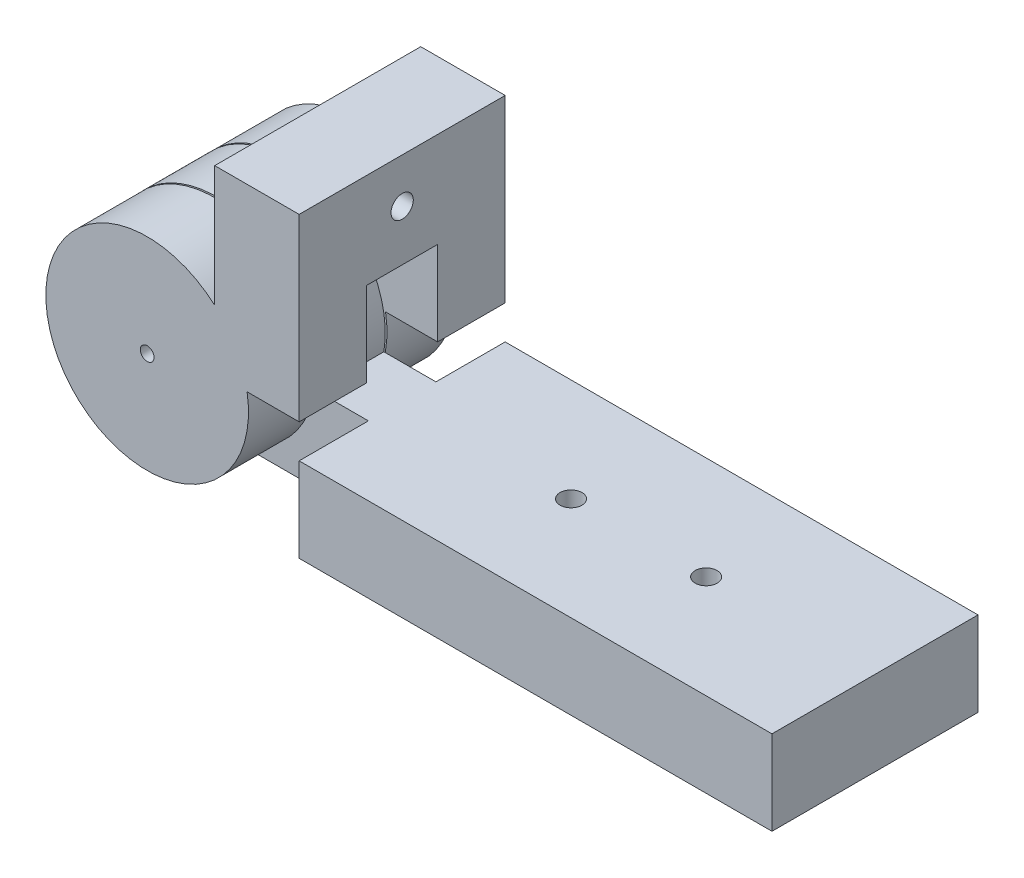
ISO-10303-21;
HEADER;
FILE_DESCRIPTION(('STEP AP214'),'2;1');
FILE_NAME('part.step','',(''),(''),'','','');
FILE_SCHEMA(('AUTOMOTIVE_DESIGN { 1 0 10303 214 1 1 1 1 }'));
ENDSEC;
DATA;
#1=APPLICATION_CONTEXT('core data for automotive mechanical design processes');
#2=APPLICATION_PROTOCOL_DEFINITION('international standard','automotive_design',2000,#1);
#3=PRODUCT_CONTEXT('',#1,'mechanical');
#4=PRODUCT('Part','Part','',(#3));
#5=PRODUCT_RELATED_PRODUCT_CATEGORY('part','',(#4));
#6=PRODUCT_DEFINITION_FORMATION('','',#4);
#7=PRODUCT_DEFINITION_CONTEXT('part definition',#1,'design');
#8=PRODUCT_DEFINITION('design','',#6,#7);
#9=PRODUCT_DEFINITION_SHAPE('','',#8);
#10=(LENGTH_UNIT() NAMED_UNIT(*) SI_UNIT(.MILLI.,.METRE.));
#11=(NAMED_UNIT(*) PLANE_ANGLE_UNIT() SI_UNIT($,.RADIAN.));
#12=(NAMED_UNIT(*) SI_UNIT($,.STERADIAN.) SOLID_ANGLE_UNIT());
#13=UNCERTAINTY_MEASURE_WITH_UNIT(LENGTH_MEASURE(1.E-05),#10,'distance_accuracy_value','');
#14=(GEOMETRIC_REPRESENTATION_CONTEXT(3) GLOBAL_UNCERTAINTY_ASSIGNED_CONTEXT((#13)) GLOBAL_UNIT_ASSIGNED_CONTEXT((#10,
#11,#12)) REPRESENTATION_CONTEXT('',''));
#15=CARTESIAN_POINT('',(0.,0.,0.));
#16=DIRECTION('',(0.,0.,1.));
#17=DIRECTION('',(1.,0.,0.));
#18=AXIS2_PLACEMENT_3D('',#15,#16,#17);
#19=CARTESIAN_POINT('',(-73.025,-41.275,6.6675));
#20=DIRECTION('',(0.,0.,1.));
#21=DIRECTION('',(1.,0.,0.));
#22=AXIS2_PLACEMENT_3D('',#19,#20,#21);
#23=PLANE('',#22);
#24=CARTESIAN_POINT('',(-73.025,-41.275,6.6675));
#25=DIRECTION('',(0.,0.,1.));
#26=DIRECTION('',(1.,0.,0.));
#27=AXIS2_PLACEMENT_3D('',#24,#25,#26);
#28=CIRCLE('',#27,5.71499999999999);
#29=CARTESIAN_POINT('',(-67.31,-41.275,6.6675));
#30=VERTEX_POINT('',#29);
#31=EDGE_CURVE('E64',#30,#30,#28,.T.);
#32=ORIENTED_EDGE('',*,*,#31,.T.);
#33=EDGE_LOOP('',(#32));
#34=FACE_BOUND('',#33,.T.);
#35=DIRECTION('',(-1.,0.,0.));
#36=VECTOR('',#35,1.);
#37=CARTESIAN_POINT('',(-44.45,-22.2250000000001,6.6675));
#38=LINE('',#37,#36);
#39=CARTESIAN_POINT('',(-44.45,-22.2250000000001,6.6675));
#40=VERTEX_POINT('',#39);
#41=CARTESIAN_POINT('',(-60.325,-22.2250000000001,6.66750000000001));
#42=VERTEX_POINT('',#41);
#43=EDGE_CURVE('E210',#40,#42,#38,.T.);
#44=ORIENTED_EDGE('',*,*,#43,.F.);
#45=DIRECTION('',(0.,-1.,0.));
#46=VECTOR('',#45,1.);
#47=CARTESIAN_POINT('',(-44.45,-38.1,6.66750000000001));
#48=LINE('',#47,#46);
#49=CARTESIAN_POINT('',(-44.45,-38.1,6.66750000000001));
#50=VERTEX_POINT('',#49);
#51=EDGE_CURVE('E184',#40,#50,#48,.T.);
#52=ORIENTED_EDGE('',*,*,#51,.T.);
#53=DIRECTION('',(-1.,0.,0.));
#54=VECTOR('',#53,1.);
#55=CARTESIAN_POINT('',(-44.45,-38.1,6.66750000000001));
#56=LINE('',#55,#54);
#57=CARTESIAN_POINT('',(-54.2414466886587,-38.1,6.6675));
#58=VERTEX_POINT('',#57);
#59=EDGE_CURVE('E180',#50,#58,#56,.T.);
#60=ORIENTED_EDGE('',*,*,#59,.T.);
#61=CARTESIAN_POINT('',(-73.025,-41.275,6.6675));
#62=DIRECTION('',(0.,0.,1.));
#63=DIRECTION('',(1.,0.,0.));
#64=AXIS2_PLACEMENT_3D('',#61,#62,#63);
#65=CIRCLE('',#64,19.05);
#66=CARTESIAN_POINT('',(-60.325,-27.0759683428763,6.66750000000001));
#67=VERTEX_POINT('',#66);
#68=EDGE_CURVE('E197',#67,#58,#65,.T.);
#69=ORIENTED_EDGE('',*,*,#68,.F.);
#70=DIRECTION('',(0.,1.,0.));
#71=VECTOR('',#70,1.);
#72=CARTESIAN_POINT('',(-60.325,38.1,6.66750000000001));
#73=LINE('',#72,#71);
#74=EDGE_CURVE('E78',#67,#42,#73,.T.);
#75=ORIENTED_EDGE('',*,*,#74,.T.);
#76=EDGE_LOOP('',(#44,#52,#60,#69,#75));
#77=FACE_BOUND('',#76,.T.);
#78=ADVANCED_FACE('F56',(#34,#77),#23,.F.);
#79=CARTESIAN_POINT('',(-73.025,-41.275,-6.6675));
#80=DIRECTION('',(0.,0.,-1.));
#81=DIRECTION('',(1.,0.,0.));
#82=AXIS2_PLACEMENT_3D('',#79,#80,#81);
#83=PLANE('',#82);
#84=CARTESIAN_POINT('',(-73.025,-41.275,-6.6675));
#85=DIRECTION('',(0.,0.,-1.));
#86=DIRECTION('',(-1.,0.,0.));
#87=AXIS2_PLACEMENT_3D('',#84,#85,#86);
#88=CIRCLE('',#87,5.71499999999999);
#89=CARTESIAN_POINT('',(-78.74,-41.275,-6.6675));
#90=VERTEX_POINT('',#89);
#91=EDGE_CURVE('E171',#90,#90,#88,.F.);
#92=ORIENTED_EDGE('',*,*,#91,.F.);
#93=EDGE_LOOP('',(#92));
#94=FACE_BOUND('',#93,.T.);
#95=DIRECTION('',(-1.,0.,0.));
#96=VECTOR('',#95,1.);
#97=CARTESIAN_POINT('',(-44.45,-22.2250000000001,-6.6675));
#98=LINE('',#97,#96);
#99=CARTESIAN_POINT('',(-44.45,-22.2250000000001,-6.66750000000001));
#100=VERTEX_POINT('',#99);
#101=CARTESIAN_POINT('',(-60.325,-22.2250000000001,-6.6675));
#102=VERTEX_POINT('',#101);
#103=EDGE_CURVE('E160',#100,#102,#98,.T.);
#104=ORIENTED_EDGE('',*,*,#103,.T.);
#105=DIRECTION('',(0.,1.,0.));
#106=VECTOR('',#105,1.);
#107=CARTESIAN_POINT('',(-60.325,38.1,-6.66750000000001));
#108=LINE('',#107,#106);
#109=CARTESIAN_POINT('',(-60.325,-27.0759683428763,-6.6675));
#110=VERTEX_POINT('',#109);
#111=EDGE_CURVE('E166',#110,#102,#108,.T.);
#112=ORIENTED_EDGE('',*,*,#111,.F.);
#113=CARTESIAN_POINT('',(-73.025,-41.275,-6.6675));
#114=DIRECTION('',(0.,0.,1.));
#115=DIRECTION('',(1.,0.,0.));
#116=AXIS2_PLACEMENT_3D('',#113,#114,#115);
#117=CIRCLE('',#116,19.05);
#118=CARTESIAN_POINT('',(-54.2414466886587,-38.1,-6.66750000000001));
#119=VERTEX_POINT('',#118);
#120=EDGE_CURVE('E172',#110,#119,#117,.T.);
#121=ORIENTED_EDGE('',*,*,#120,.T.);
#122=DIRECTION('',(-1.,0.,0.));
#123=VECTOR('',#122,1.);
#124=CARTESIAN_POINT('',(-44.45,-38.1,-6.66750000000001));
#125=LINE('',#124,#123);
#126=CARTESIAN_POINT('',(-44.45,-38.1,-6.66750000000001));
#127=VERTEX_POINT('',#126);
#128=EDGE_CURVE('E175',#127,#119,#125,.T.);
#129=ORIENTED_EDGE('',*,*,#128,.F.);
#130=DIRECTION('',(0.,-1.,0.));
#131=VECTOR('',#130,1.);
#132=CARTESIAN_POINT('',(-44.45,-38.1,-6.66750000000001));
#133=LINE('',#132,#131);
#134=EDGE_CURVE('E227',#100,#127,#133,.T.);
#135=ORIENTED_EDGE('',*,*,#134,.F.);
#136=EDGE_LOOP('',(#104,#112,#121,#129,#135));
#137=FACE_BOUND('',#136,.T.);
#138=ADVANCED_FACE('F239',(#94,#137),#83,.F.);
#139=CARTESIAN_POINT('',(-73.025,-41.275,-19.3675));
#140=DIRECTION('',(0.,0.,1.));
#141=DIRECTION('',(1.,0.,0.));
#142=AXIS2_PLACEMENT_3D('',#139,#140,#141);
#143=CYLINDRICAL_SURFACE('',#142,19.05);
#144=ORIENTED_EDGE('',*,*,#120,.F.);
#145=DIRECTION('',(0.,0.,-1.));
#146=VECTOR('',#145,1.);
#147=CARTESIAN_POINT('',(-60.325,-27.0759683428763,84.5035817680336));
#148=LINE('',#147,#146);
#149=CARTESIAN_POINT('',(-60.325,-27.0759683428763,-19.3675));
#150=VERTEX_POINT('',#149);
#151=EDGE_CURVE('E167',#110,#150,#148,.T.);
#152=ORIENTED_EDGE('',*,*,#151,.T.);
#153=CARTESIAN_POINT('',(-73.025,-41.275,-19.3675));
#154=DIRECTION('',(0.,0.,1.));
#155=DIRECTION('',(1.,0.,0.));
#156=AXIS2_PLACEMENT_3D('',#153,#154,#155);
#157=CIRCLE('',#156,19.05);
#158=CARTESIAN_POINT('',(-54.2414466886587,-38.1,-19.3675));
#159=VERTEX_POINT('',#158);
#160=EDGE_CURVE('E153',#150,#159,#157,.T.);
#161=ORIENTED_EDGE('',*,*,#160,.T.);
#162=DIRECTION('',(0.,0.,-1.));
#163=VECTOR('',#162,1.);
#164=CARTESIAN_POINT('',(-54.2414466886587,-38.1,84.5035817680336));
#165=LINE('',#164,#163);
#166=EDGE_CURVE('E157',#119,#159,#165,.T.);
#167=ORIENTED_EDGE('',*,*,#166,.F.);
#168=EDGE_LOOP('',(#144,#152,#161,#167));
#169=FACE_BOUND('',#168,.T.);
#170=ADVANCED_FACE('F237',(#169),#143,.T.);
#171=CARTESIAN_POINT('',(-73.025,-41.275,-6.6675));
#172=DIRECTION('',(0.,0.,1.));
#173=DIRECTION('',(1.,0.,0.));
#174=AXIS2_PLACEMENT_3D('',#171,#172,#173);
#175=CYLINDRICAL_SURFACE('',#174,5.71499999999999);
#176=ORIENTED_EDGE('',*,*,#91,.T.);
#177=EDGE_LOOP('',(#176));
#178=FACE_BOUND('',#177,.T.);
#179=ORIENTED_EDGE('',*,*,#31,.F.);
#180=EDGE_LOOP('',(#179));
#181=FACE_BOUND('',#180,.T.);
#182=ADVANCED_FACE('F58',(#178,#181),#175,.T.);
#183=CARTESIAN_POINT('',(-73.025,-41.275,19.3675));
#184=DIRECTION('',(0.,0.,-1.));
#185=DIRECTION('',(-1.,0.,0.));
#186=AXIS2_PLACEMENT_3D('',#183,#184,#185);
#187=CYLINDRICAL_SURFACE('',#186,19.05);
#188=ORIENTED_EDGE('',*,*,#68,.T.);
#189=DIRECTION('',(0.,0.,1.));
#190=VECTOR('',#189,1.);
#191=CARTESIAN_POINT('',(-54.2414466886587,-38.1,-71.1685817680336));
#192=LINE('',#191,#190);
#193=CARTESIAN_POINT('',(-54.2414466886587,-38.1,19.3675));
#194=VERTEX_POINT('',#193);
#195=EDGE_CURVE('E181',#58,#194,#192,.T.);
#196=ORIENTED_EDGE('',*,*,#195,.T.);
#197=CARTESIAN_POINT('',(-73.025,-41.275,19.3675));
#198=DIRECTION('',(0.,0.,1.));
#199=DIRECTION('',(1.,0.,0.));
#200=AXIS2_PLACEMENT_3D('',#197,#198,#199);
#201=CIRCLE('',#200,19.05);
#202=CARTESIAN_POINT('',(-60.325,-27.0759683428763,19.3675));
#203=VERTEX_POINT('',#202);
#204=EDGE_CURVE('E198',#203,#194,#201,.T.);
#205=ORIENTED_EDGE('',*,*,#204,.F.);
#206=DIRECTION('',(0.,0.,1.));
#207=VECTOR('',#206,1.);
#208=CARTESIAN_POINT('',(-60.325,-27.0759683428763,-71.1685817680336));
#209=LINE('',#208,#207);
#210=EDGE_CURVE('E193',#67,#203,#209,.T.);
#211=ORIENTED_EDGE('',*,*,#210,.F.);
#212=EDGE_LOOP('',(#188,#196,#205,#211));
#213=FACE_BOUND('',#212,.T.);
#214=ADVANCED_FACE('F258',(#213),#187,.T.);
#215=CARTESIAN_POINT('',(-73.025,-41.275,19.3675));
#216=DIRECTION('',(0.,0.,1.));
#217=DIRECTION('',(1.,0.,0.));
#218=AXIS2_PLACEMENT_3D('',#215,#216,#217);
#219=PLANE('',#218);
#220=CARTESIAN_POINT('',(-73.025,-41.275,19.3675));
#221=DIRECTION('',(0.,0.,1.));
#222=DIRECTION('',(1.,0.,0.));
#223=AXIS2_PLACEMENT_3D('',#220,#221,#222);
#224=CIRCLE('',#223,1.288075884885);
#225=CARTESIAN_POINT('',(-71.736924115115,-41.275,19.3675));
#226=VERTEX_POINT('',#225);
#227=EDGE_CURVE('E307',#226,#226,#224,.T.);
#228=ORIENTED_EDGE('',*,*,#227,.F.);
#229=EDGE_LOOP('',(#228));
#230=FACE_BOUND('',#229,.T.);
#231=DIRECTION('',(-1.,0.,0.));
#232=VECTOR('',#231,1.);
#233=CARTESIAN_POINT('',(44.45,-4.31799999999998,19.3675));
#234=LINE('',#233,#232);
#235=CARTESIAN_POINT('',(-44.45,-4.31799999999999,19.3675));
#236=VERTEX_POINT('',#235);
#237=CARTESIAN_POINT('',(-60.325,-4.31799999999999,19.3675));
#238=VERTEX_POINT('',#237);
#239=EDGE_CURVE('E146',#236,#238,#234,.T.);
#240=ORIENTED_EDGE('',*,*,#239,.T.);
#241=DIRECTION('',(0.,-1.,0.));
#242=VECTOR('',#241,1.);
#243=CARTESIAN_POINT('',(-60.325,38.1,19.3675));
#244=LINE('',#243,#242);
#245=EDGE_CURVE('E145',#238,#203,#244,.T.);
#246=ORIENTED_EDGE('',*,*,#245,.T.);
#247=ORIENTED_EDGE('',*,*,#204,.T.);
#248=DIRECTION('',(1.,0.,0.));
#249=VECTOR('',#248,1.);
#250=CARTESIAN_POINT('',(-44.45,-38.1,19.3675));
#251=LINE('',#250,#249);
#252=CARTESIAN_POINT('',(-44.45,-38.1,19.3675));
#253=VERTEX_POINT('',#252);
#254=EDGE_CURVE('E178',#194,#253,#251,.T.);
#255=ORIENTED_EDGE('',*,*,#254,.T.);
#256=DIRECTION('',(0.,1.,0.));
#257=VECTOR('',#256,1.);
#258=CARTESIAN_POINT('',(-44.45,-38.1,19.3675));
#259=LINE('',#258,#257);
#260=EDGE_CURVE('E187',#253,#236,#259,.T.);
#261=ORIENTED_EDGE('',*,*,#260,.T.);
#262=EDGE_LOOP('',(#240,#246,#247,#255,#261));
#263=FACE_BOUND('',#262,.T.);
#264=ADVANCED_FACE('F254',(#230,#263),#219,.T.);
#265=CARTESIAN_POINT('',(-44.45,-38.1,-71.1685817680336));
#266=DIRECTION('',(0.,-1.,0.));
#267=DIRECTION('',(0.,0.,-1.));
#268=AXIS2_PLACEMENT_3D('',#265,#266,#267);
#269=PLANE('',#268);
#270=ORIENTED_EDGE('',*,*,#59,.F.);
#271=DIRECTION('',(0.,0.,1.));
#272=VECTOR('',#271,1.);
#273=CARTESIAN_POINT('',(-44.45,-38.1,-71.1685817680336));
#274=LINE('',#273,#272);
#275=EDGE_CURVE('E191',#50,#253,#274,.T.);
#276=ORIENTED_EDGE('',*,*,#275,.T.);
#277=ORIENTED_EDGE('',*,*,#254,.F.);
#278=ORIENTED_EDGE('',*,*,#195,.F.);
#279=EDGE_LOOP('',(#270,#276,#277,#278));
#280=FACE_BOUND('',#279,.T.);
#281=ADVANCED_FACE('F248',(#280),#269,.T.);
#282=CARTESIAN_POINT('',(-60.325,38.1,-71.1685817680336));
#283=DIRECTION('',(-1.,0.,0.));
#284=DIRECTION('',(0.,-1.,0.));
#285=AXIS2_PLACEMENT_3D('',#282,#283,#284);
#286=PLANE('',#285);
#287=DIRECTION('',(0.,0.,1.));
#288=VECTOR('',#287,1.);
#289=CARTESIAN_POINT('',(-60.325,-4.31799999999999,-19.3675));
#290=LINE('',#289,#288);
#291=CARTESIAN_POINT('',(-60.325,-4.31799999999999,-19.3675));
#292=VERTEX_POINT('',#291);
#293=EDGE_CURVE('E132',#292,#238,#290,.T.);
#294=ORIENTED_EDGE('',*,*,#293,.F.);
#295=DIRECTION('',(0.,-1.,0.));
#296=VECTOR('',#295,1.);
#297=CARTESIAN_POINT('',(-60.325,38.1,-19.3675));
#298=LINE('',#297,#296);
#299=EDGE_CURVE('E142',#292,#150,#298,.T.);
#300=ORIENTED_EDGE('',*,*,#299,.T.);
#301=ORIENTED_EDGE('',*,*,#151,.F.);
#302=ORIENTED_EDGE('',*,*,#111,.T.);
#303=DIRECTION('',(0.,0.,1.));
#304=VECTOR('',#303,1.);
#305=CARTESIAN_POINT('',(-60.325,-22.2250000000001,-69.0463525864335));
#306=LINE('',#305,#304);
#307=EDGE_CURVE('E221',#102,#42,#306,.T.);
#308=ORIENTED_EDGE('',*,*,#307,.T.);
#309=ORIENTED_EDGE('',*,*,#74,.F.);
#310=ORIENTED_EDGE('',*,*,#210,.T.);
#311=ORIENTED_EDGE('',*,*,#245,.F.);
#312=EDGE_LOOP('',(#294,#300,#301,#302,#308,#309,#310,#311));
#313=FACE_BOUND('',#312,.T.);
#314=CARTESIAN_POINT('',(-60.325,-12.7,0.));
#315=DIRECTION('',(-1.,0.,0.));
#316=DIRECTION('',(0.,-1.,0.));
#317=AXIS2_PLACEMENT_3D('',#314,#315,#316);
#318=CIRCLE('',#317,2.0955);
#319=CARTESIAN_POINT('',(-60.325,-14.7955,0.));
#320=VERTEX_POINT('',#319);
#321=EDGE_CURVE('E206',#320,#320,#318,.T.);
#322=ORIENTED_EDGE('',*,*,#321,.F.);
#323=EDGE_LOOP('',(#322));
#324=FACE_BOUND('',#323,.T.);
#325=ADVANCED_FACE('F140',(#313,#324),#286,.T.);
#326=CARTESIAN_POINT('',(-44.45,-38.1,-71.1685817680336));
#327=DIRECTION('',(1.,0.,0.));
#328=DIRECTION('',(0.,1.,0.));
#329=AXIS2_PLACEMENT_3D('',#326,#327,#328);
#330=PLANE('',#329);
#331=DIRECTION('',(0.,0.,-1.));
#332=VECTOR('',#331,1.);
#333=CARTESIAN_POINT('',(-44.45,-4.31799999999999,-71.1685817680336));
#334=LINE('',#333,#332);
#335=CARTESIAN_POINT('',(-44.45,-4.318,-19.3675));
#336=VERTEX_POINT('',#335);
#337=EDGE_CURVE('E70',#236,#336,#334,.T.);
#338=ORIENTED_EDGE('',*,*,#337,.F.);
#339=ORIENTED_EDGE('',*,*,#260,.F.);
#340=ORIENTED_EDGE('',*,*,#275,.F.);
#341=ORIENTED_EDGE('',*,*,#51,.F.);
#342=DIRECTION('',(0.,0.,1.));
#343=VECTOR('',#342,1.);
#344=CARTESIAN_POINT('',(-44.45,-22.2250000000001,-69.0463525864335));
#345=LINE('',#344,#343);
#346=EDGE_CURVE('E205',#100,#40,#345,.T.);
#347=ORIENTED_EDGE('',*,*,#346,.F.);
#348=ORIENTED_EDGE('',*,*,#134,.T.);
#349=DIRECTION('',(0.,0.,-1.));
#350=VECTOR('',#349,1.);
#351=CARTESIAN_POINT('',(-44.45,-38.1,84.5035817680336));
#352=LINE('',#351,#350);
#353=CARTESIAN_POINT('',(-44.45,-38.1,-19.3675));
#354=VERTEX_POINT('',#353);
#355=EDGE_CURVE('E164',#127,#354,#352,.T.);
#356=ORIENTED_EDGE('',*,*,#355,.T.);
#357=DIRECTION('',(0.,1.,0.));
#358=VECTOR('',#357,1.);
#359=CARTESIAN_POINT('',(-44.45,-38.1,-19.3675));
#360=LINE('',#359,#358);
#361=EDGE_CURVE('E154',#354,#336,#360,.T.);
#362=ORIENTED_EDGE('',*,*,#361,.T.);
#363=EDGE_LOOP('',(#338,#339,#340,#341,#347,#348,#356,#362));
#364=FACE_BOUND('',#363,.T.);
#365=CARTESIAN_POINT('',(-44.45,-12.7,0.));
#366=DIRECTION('',(1.,0.,0.));
#367=DIRECTION('',(0.,1.,0.));
#368=AXIS2_PLACEMENT_3D('',#365,#366,#367);
#369=CIRCLE('',#368,2.0955);
#370=CARTESIAN_POINT('',(-44.45,-10.6045,0.));
#371=VERTEX_POINT('',#370);
#372=EDGE_CURVE('E203',#371,#371,#369,.T.);
#373=ORIENTED_EDGE('',*,*,#372,.F.);
#374=EDGE_LOOP('',(#373));
#375=FACE_BOUND('',#374,.T.);
#376=ADVANCED_FACE('F251',(#364,#375),#330,.T.);
#377=CARTESIAN_POINT('',(-73.025,-41.275,-19.3675));
#378=DIRECTION('',(0.,0.,-1.));
#379=DIRECTION('',(1.,0.,0.));
#380=AXIS2_PLACEMENT_3D('',#377,#378,#379);
#381=PLANE('',#380);
#382=CARTESIAN_POINT('',(-73.025,-41.275,-19.3675));
#383=DIRECTION('',(0.,0.,1.));
#384=DIRECTION('',(1.,0.,0.));
#385=AXIS2_PLACEMENT_3D('',#382,#383,#384);
#386=CIRCLE('',#385,1.288075884885);
#387=CARTESIAN_POINT('',(-71.736924115115,-41.275,-19.3675));
#388=VERTEX_POINT('',#387);
#389=EDGE_CURVE('E147',#388,#388,#386,.T.);
#390=ORIENTED_EDGE('',*,*,#389,.T.);
#391=EDGE_LOOP('',(#390));
#392=FACE_BOUND('',#391,.T.);
#393=DIRECTION('',(-1.,0.,0.));
#394=VECTOR('',#393,1.);
#395=CARTESIAN_POINT('',(-73.025,-4.318,-19.3675));
#396=LINE('',#395,#394);
#397=EDGE_CURVE('E14',#336,#292,#396,.T.);
#398=ORIENTED_EDGE('',*,*,#397,.F.);
#399=ORIENTED_EDGE('',*,*,#361,.F.);
#400=DIRECTION('',(1.,0.,0.));
#401=VECTOR('',#400,1.);
#402=CARTESIAN_POINT('',(-44.45,-38.1,-19.3675));
#403=LINE('',#402,#401);
#404=EDGE_CURVE('E155',#159,#354,#403,.T.);
#405=ORIENTED_EDGE('',*,*,#404,.F.);
#406=ORIENTED_EDGE('',*,*,#160,.F.);
#407=ORIENTED_EDGE('',*,*,#299,.F.);
#408=EDGE_LOOP('',(#398,#399,#405,#406,#407));
#409=FACE_BOUND('',#408,.T.);
#410=ADVANCED_FACE('F150',(#392,#409),#381,.T.);
#411=CARTESIAN_POINT('',(-44.45,-38.1,84.5035817680336));
#412=DIRECTION('',(0.,1.,0.));
#413=DIRECTION('',(0.,0.,1.));
#414=AXIS2_PLACEMENT_3D('',#411,#412,#413);
#415=PLANE('',#414);
#416=ORIENTED_EDGE('',*,*,#355,.F.);
#417=ORIENTED_EDGE('',*,*,#128,.T.);
#418=ORIENTED_EDGE('',*,*,#166,.T.);
#419=ORIENTED_EDGE('',*,*,#404,.T.);
#420=EDGE_LOOP('',(#416,#417,#418,#419));
#421=FACE_BOUND('',#420,.T.);
#422=ADVANCED_FACE('F232',(#421),#415,.F.);
#423=CARTESIAN_POINT('',(-44.45,-22.2250000000001,-69.0463525864335));
#424=DIRECTION('',(0.,1.,0.));
#425=DIRECTION('',(0.,0.,1.));
#426=AXIS2_PLACEMENT_3D('',#423,#424,#425);
#427=PLANE('',#426);
#428=ORIENTED_EDGE('',*,*,#103,.F.);
#429=ORIENTED_EDGE('',*,*,#346,.T.);
#430=ORIENTED_EDGE('',*,*,#43,.T.);
#431=ORIENTED_EDGE('',*,*,#307,.F.);
#432=EDGE_LOOP('',(#428,#429,#430,#431));
#433=FACE_BOUND('',#432,.T.);
#434=ADVANCED_FACE('F242',(#433),#427,.F.);
#435=CARTESIAN_POINT('',(44.45,-12.7,0.));
#436=DIRECTION('',(-1.,0.,0.));
#437=DIRECTION('',(0.,-1.,0.));
#438=AXIS2_PLACEMENT_3D('',#435,#436,#437);
#439=CYLINDRICAL_SURFACE('',#438,2.0955);
#440=ORIENTED_EDGE('',*,*,#372,.T.);
#441=EDGE_LOOP('',(#440));
#442=FACE_BOUND('',#441,.T.);
#443=ORIENTED_EDGE('',*,*,#321,.T.);
#444=EDGE_LOOP('',(#443));
#445=FACE_BOUND('',#444,.T.);
#446=ADVANCED_FACE('F292',(#442,#445),#439,.F.);
#447=CARTESIAN_POINT('',(44.45,-4.31799999999998,-19.3675));
#448=DIRECTION('',(0.,-1.,0.));
#449=DIRECTION('',(1.,0.,0.));
#450=AXIS2_PLACEMENT_3D('',#447,#448,#449);
#451=PLANE('',#450);
#452=ORIENTED_EDGE('',*,*,#337,.T.);
#453=ORIENTED_EDGE('',*,*,#397,.T.);
#454=ORIENTED_EDGE('',*,*,#293,.T.);
#455=ORIENTED_EDGE('',*,*,#239,.F.);
#456=EDGE_LOOP('',(#452,#453,#454,#455));
#457=FACE_BOUND('',#456,.T.);
#458=ADVANCED_FACE('F131',(#457),#451,.F.);
#459=CARTESIAN_POINT('',(-73.025,-41.275,-19.3675));
#460=DIRECTION('',(0.,0.,1.));
#461=DIRECTION('',(1.,0.,0.));
#462=AXIS2_PLACEMENT_3D('',#459,#460,#461);
#463=CYLINDRICAL_SURFACE('',#462,1.288075884885);
#464=ORIENTED_EDGE('',*,*,#389,.F.);
#465=EDGE_LOOP('',(#464));
#466=FACE_BOUND('',#465,.T.);
#467=ORIENTED_EDGE('',*,*,#227,.T.);
#468=EDGE_LOOP('',(#467));
#469=FACE_BOUND('',#468,.T.);
#470=ADVANCED_FACE('F297',(#466,#469),#463,.F.);
#471=CLOSED_SHELL('',(#78,#138,#170,#182,#214,#264,#281,#325,#376,#410,#422,#434,#446,#458,#470));
#472=MANIFOLD_SOLID_BREP('B2',#471);
#473=CARTESIAN_POINT('',(-73.025,-41.275,6.35));
#474=DIRECTION('',(0.,0.,1.));
#475=DIRECTION('',(1.,0.,0.));
#476=AXIS2_PLACEMENT_3D('',#473,#474,#475);
#477=PLANE('',#476);
#478=CARTESIAN_POINT('',(-73.025,-41.275,6.35));
#479=DIRECTION('',(0.,0.,1.));
#480=DIRECTION('',(1.,0.,0.));
#481=AXIS2_PLACEMENT_3D('',#478,#479,#480);
#482=CIRCLE('',#481,6.35);
#483=CARTESIAN_POINT('',(-66.675,-41.275,6.35));
#484=VERTEX_POINT('',#483);
#485=EDGE_CURVE('E546',#484,#484,#482,.T.);
#486=ORIENTED_EDGE('',*,*,#485,.F.);
#487=EDGE_LOOP('',(#486));
#488=FACE_BOUND('',#487,.T.);
#489=DIRECTION('',(1.,0.,0.));
#490=VECTOR('',#489,1.);
#491=CARTESIAN_POINT('',(44.45,-60.325,6.35));
#492=LINE('',#491,#490);
#493=CARTESIAN_POINT('',(-73.025,-60.3250000000001,6.35));
#494=VERTEX_POINT('',#493);
#495=CARTESIAN_POINT('',(-44.45,-60.325,6.35));
#496=VERTEX_POINT('',#495);
#497=EDGE_CURVE('E550',#494,#496,#492,.T.);
#498=ORIENTED_EDGE('',*,*,#497,.T.);
#499=DIRECTION('',(0.,1.,0.));
#500=VECTOR('',#499,1.);
#501=CARTESIAN_POINT('',(-44.45,-41.275,6.35));
#502=LINE('',#501,#500);
#503=CARTESIAN_POINT('',(-44.45,-44.45,6.35));
#504=VERTEX_POINT('',#503);
#505=EDGE_CURVE('E443',#496,#504,#502,.T.);
#506=ORIENTED_EDGE('',*,*,#505,.T.);
#507=DIRECTION('',(-1.,0.,0.));
#508=VECTOR('',#507,1.);
#509=CARTESIAN_POINT('',(-54.2414466886587,-44.45,6.35));
#510=LINE('',#509,#508);
#511=CARTESIAN_POINT('',(-54.2414466886587,-44.45,6.35));
#512=VERTEX_POINT('',#511);
#513=EDGE_CURVE('E557',#504,#512,#510,.T.);
#514=ORIENTED_EDGE('',*,*,#513,.T.);
#515=CARTESIAN_POINT('',(-73.025,-41.275,6.35));
#516=DIRECTION('',(0.,0.,1.));
#517=DIRECTION('',(1.,0.,0.));
#518=AXIS2_PLACEMENT_3D('',#515,#516,#517);
#519=CIRCLE('',#518,19.05);
#520=EDGE_CURVE('E54',#512,#494,#519,.T.);
#521=ORIENTED_EDGE('',*,*,#520,.T.);
#522=EDGE_LOOP('',(#498,#506,#514,#521));
#523=FACE_BOUND('',#522,.T.);
#524=ADVANCED_FACE('F428',(#488,#523),#477,.T.);
#525=CARTESIAN_POINT('',(-73.025,-41.275,-6.35));
#526=DIRECTION('',(0.,0.,1.));
#527=DIRECTION('',(1.,0.,0.));
#528=AXIS2_PLACEMENT_3D('',#525,#526,#527);
#529=PLANE('',#528);
#530=CARTESIAN_POINT('',(-73.025,-41.275,-6.35));
#531=DIRECTION('',(0.,0.,1.));
#532=DIRECTION('',(1.,0.,0.));
#533=AXIS2_PLACEMENT_3D('',#530,#531,#532);
#534=CIRCLE('',#533,6.35);
#535=CARTESIAN_POINT('',(-66.675,-41.275,-6.35));
#536=VERTEX_POINT('',#535);
#537=EDGE_CURVE('E547',#536,#536,#534,.T.);
#538=ORIENTED_EDGE('',*,*,#537,.T.);
#539=EDGE_LOOP('',(#538));
#540=FACE_BOUND('',#539,.T.);
#541=DIRECTION('',(0.,1.,0.));
#542=VECTOR('',#541,1.);
#543=CARTESIAN_POINT('',(-44.45,-41.275,-6.35));
#544=LINE('',#543,#542);
#545=CARTESIAN_POINT('',(-44.45,-60.325,-6.34999999999999));
#546=VERTEX_POINT('',#545);
#547=CARTESIAN_POINT('',(-44.45,-44.45,-6.34999999999999));
#548=VERTEX_POINT('',#547);
#549=EDGE_CURVE('E499',#546,#548,#544,.T.);
#550=ORIENTED_EDGE('',*,*,#549,.F.);
#551=DIRECTION('',(-1.,0.,0.));
#552=VECTOR('',#551,1.);
#553=CARTESIAN_POINT('',(44.45,-60.325,-6.34999999999999));
#554=LINE('',#553,#552);
#555=CARTESIAN_POINT('',(-73.025,-60.3250000000001,-6.35));
#556=VERTEX_POINT('',#555);
#557=EDGE_CURVE('E554',#546,#556,#554,.T.);
#558=ORIENTED_EDGE('',*,*,#557,.T.);
#559=CARTESIAN_POINT('',(-73.025,-41.275,-6.35));
#560=DIRECTION('',(0.,0.,1.));
#561=DIRECTION('',(1.,0.,0.));
#562=AXIS2_PLACEMENT_3D('',#559,#560,#561);
#563=CIRCLE('',#562,19.05);
#564=CARTESIAN_POINT('',(-54.2414466886587,-44.45,-6.34999999999999));
#565=VERTEX_POINT('',#564);
#566=EDGE_CURVE('E432',#565,#556,#563,.T.);
#567=ORIENTED_EDGE('',*,*,#566,.F.);
#568=DIRECTION('',(1.,0.,0.));
#569=VECTOR('',#568,1.);
#570=CARTESIAN_POINT('',(-54.2414466886587,-44.45,-6.34999999999999));
#571=LINE('',#570,#569);
#572=EDGE_CURVE('E451',#565,#548,#571,.T.);
#573=ORIENTED_EDGE('',*,*,#572,.T.);
#574=EDGE_LOOP('',(#550,#558,#567,#573));
#575=FACE_BOUND('',#574,.T.);
#576=ADVANCED_FACE('F595',(#540,#575),#529,.F.);
#577=CARTESIAN_POINT('',(-73.025,-41.275,6.35));
#578=DIRECTION('',(0.,0.,-1.));
#579=DIRECTION('',(-1.,0.,0.));
#580=AXIS2_PLACEMENT_3D('',#577,#578,#579);
#581=CYLINDRICAL_SURFACE('',#580,19.05);
#582=ORIENTED_EDGE('',*,*,#520,.F.);
#583=DIRECTION('',(0.,0.,1.));
#584=VECTOR('',#583,1.);
#585=CARTESIAN_POINT('',(-54.2414466886587,-44.45,-124.892782361475));
#586=LINE('',#585,#584);
#587=EDGE_CURVE('E555',#565,#512,#586,.T.);
#588=ORIENTED_EDGE('',*,*,#587,.F.);
#589=ORIENTED_EDGE('',*,*,#566,.T.);
#590=DIRECTION('',(0.,0.,1.));
#591=VECTOR('',#590,1.);
#592=CARTESIAN_POINT('',(-73.025,-60.3250000000001,-124.892782361475));
#593=LINE('',#592,#591);
#594=EDGE_CURVE('E559',#556,#494,#593,.T.);
#595=ORIENTED_EDGE('',*,*,#594,.T.);
#596=EDGE_LOOP('',(#582,#588,#589,#595));
#597=FACE_BOUND('',#596,.T.);
#598=ADVANCED_FACE('F430',(#597),#581,.T.);
#599=CARTESIAN_POINT('',(-54.2414466886587,-44.45,-124.892782361475));
#600=DIRECTION('',(0.,1.,0.));
#601=DIRECTION('',(-1.,0.,0.));
#602=AXIS2_PLACEMENT_3D('',#599,#600,#601);
#603=PLANE('',#602);
#604=CARTESIAN_POINT('',(12.7,-44.45,0.));
#605=DIRECTION('',(0.,1.,0.));
#606=DIRECTION('',(-1.,0.,0.));
#607=AXIS2_PLACEMENT_3D('',#604,#605,#606);
#608=CIRCLE('',#607,2.06375);
#609=CARTESIAN_POINT('',(10.63625,-44.45,0.));
#610=VERTEX_POINT('',#609);
#611=EDGE_CURVE('E632',#610,#610,#608,.T.);
#612=ORIENTED_EDGE('',*,*,#611,.F.);
#613=EDGE_LOOP('',(#612));
#614=FACE_BOUND('',#613,.T.);
#615=CARTESIAN_POINT('',(-12.7,-44.45,0.));
#616=DIRECTION('',(0.,1.,0.));
#617=DIRECTION('',(-1.,0.,0.));
#618=AXIS2_PLACEMENT_3D('',#615,#616,#617);
#619=CIRCLE('',#618,2.06375);
#620=CARTESIAN_POINT('',(-14.76375,-44.45,0.));
#621=VERTEX_POINT('',#620);
#622=EDGE_CURVE('E521',#621,#621,#619,.T.);
#623=ORIENTED_EDGE('',*,*,#622,.F.);
#624=EDGE_LOOP('',(#623));
#625=FACE_BOUND('',#624,.T.);
#626=DIRECTION('',(0.,0.,1.));
#627=VECTOR('',#626,1.);
#628=CARTESIAN_POINT('',(44.45,-44.45,-124.892782361475));
#629=LINE('',#628,#627);
#630=CARTESIAN_POINT('',(44.45,-44.45,-19.3675));
#631=VERTEX_POINT('',#630);
#632=CARTESIAN_POINT('',(44.45,-44.45,19.3675));
#633=VERTEX_POINT('',#632);
#634=EDGE_CURVE('E517',#631,#633,#629,.T.);
#635=ORIENTED_EDGE('',*,*,#634,.F.);
#636=DIRECTION('',(-1.,0.,0.));
#637=VECTOR('',#636,1.);
#638=CARTESIAN_POINT('',(44.45,-44.45,-19.3675));
#639=LINE('',#638,#637);
#640=CARTESIAN_POINT('',(-44.45,-44.45,-19.3675));
#641=VERTEX_POINT('',#640);
#642=EDGE_CURVE('E510',#631,#641,#639,.T.);
#643=ORIENTED_EDGE('',*,*,#642,.T.);
#644=DIRECTION('',(0.,0.,-1.));
#645=VECTOR('',#644,1.);
#646=CARTESIAN_POINT('',(-44.45,-44.45,109.673787848632));
#647=LINE('',#646,#645);
#648=EDGE_CURVE('E494',#548,#641,#647,.T.);
#649=ORIENTED_EDGE('',*,*,#648,.F.);
#650=ORIENTED_EDGE('',*,*,#572,.F.);
#651=ORIENTED_EDGE('',*,*,#587,.T.);
#652=ORIENTED_EDGE('',*,*,#513,.F.);
#653=CARTESIAN_POINT('',(-44.45,-44.45,19.3675));
#654=VERTEX_POINT('',#653);
#655=EDGE_CURVE('E502',#654,#504,#647,.T.);
#656=ORIENTED_EDGE('',*,*,#655,.F.);
#657=DIRECTION('',(-1.,0.,0.));
#658=VECTOR('',#657,1.);
#659=CARTESIAN_POINT('',(44.45,-44.45,19.3675));
#660=LINE('',#659,#658);
#661=EDGE_CURVE('E530',#633,#654,#660,.T.);
#662=ORIENTED_EDGE('',*,*,#661,.F.);
#663=EDGE_LOOP('',(#635,#643,#649,#650,#651,#652,#656,#662));
#664=FACE_BOUND('',#663,.T.);
#665=ADVANCED_FACE('F515',(#614,#625,#664),#603,.T.);
#666=CARTESIAN_POINT('',(44.45,-44.45,-124.892782361475));
#667=DIRECTION('',(1.,0.,0.));
#668=DIRECTION('',(0.,0.,-1.));
#669=AXIS2_PLACEMENT_3D('',#666,#667,#668);
#670=PLANE('',#669);
#671=DIRECTION('',(0.,0.,1.));
#672=VECTOR('',#671,1.);
#673=CARTESIAN_POINT('',(44.45,-60.325,-124.892782361475));
#674=LINE('',#673,#672);
#675=CARTESIAN_POINT('',(44.45,-60.325,-19.3675));
#676=VERTEX_POINT('',#675);
#677=CARTESIAN_POINT('',(44.45,-60.325,19.3675));
#678=VERTEX_POINT('',#677);
#679=EDGE_CURVE('E563',#676,#678,#674,.T.);
#680=ORIENTED_EDGE('',*,*,#679,.F.);
#681=DIRECTION('',(0.,1.,0.));
#682=VECTOR('',#681,1.);
#683=CARTESIAN_POINT('',(44.45,-60.325,-19.3675));
#684=LINE('',#683,#682);
#685=EDGE_CURVE('E503',#676,#631,#684,.T.);
#686=ORIENTED_EDGE('',*,*,#685,.T.);
#687=ORIENTED_EDGE('',*,*,#634,.T.);
#688=DIRECTION('',(0.,1.,0.));
#689=VECTOR('',#688,1.);
#690=CARTESIAN_POINT('',(44.45,-60.325,19.3675));
#691=LINE('',#690,#689);
#692=EDGE_CURVE('E533',#678,#633,#691,.T.);
#693=ORIENTED_EDGE('',*,*,#692,.F.);
#694=EDGE_LOOP('',(#680,#686,#687,#693));
#695=FACE_BOUND('',#694,.T.);
#696=ADVANCED_FACE('F582',(#695),#670,.T.);
#697=CARTESIAN_POINT('',(44.45,-60.325,-124.892782361475));
#698=DIRECTION('',(0.,-1.,0.));
#699=DIRECTION('',(1.,0.,0.));
#700=AXIS2_PLACEMENT_3D('',#697,#698,#699);
#701=PLANE('',#700);
#702=CARTESIAN_POINT('',(12.7,-60.3250000000001,0.));
#703=DIRECTION('',(0.,1.,0.));
#704=DIRECTION('',(-1.,0.,0.));
#705=AXIS2_PLACEMENT_3D('',#702,#703,#704);
#706=CIRCLE('',#705,2.06375);
#707=CARTESIAN_POINT('',(10.63625,-60.3250000000001,0.));
#708=VERTEX_POINT('',#707);
#709=EDGE_CURVE('E629',#708,#708,#706,.T.);
#710=ORIENTED_EDGE('',*,*,#709,.T.);
#711=EDGE_LOOP('',(#710));
#712=FACE_BOUND('',#711,.T.);
#713=CARTESIAN_POINT('',(-12.7,-60.3250000000001,0.));
#714=DIRECTION('',(0.,1.,0.));
#715=DIRECTION('',(-1.,0.,0.));
#716=AXIS2_PLACEMENT_3D('',#713,#714,#715);
#717=CIRCLE('',#716,2.06375);
#718=CARTESIAN_POINT('',(-14.76375,-60.3250000000001,0.));
#719=VERTEX_POINT('',#718);
#720=EDGE_CURVE('E518',#719,#719,#717,.T.);
#721=ORIENTED_EDGE('',*,*,#720,.T.);
#722=EDGE_LOOP('',(#721));
#723=FACE_BOUND('',#722,.T.);
#724=ORIENTED_EDGE('',*,*,#679,.T.);
#725=DIRECTION('',(1.,0.,0.));
#726=VECTOR('',#725,1.);
#727=CARTESIAN_POINT('',(44.45,-60.325,19.3675));
#728=LINE('',#727,#726);
#729=CARTESIAN_POINT('',(-44.45,-60.325,19.3675));
#730=VERTEX_POINT('',#729);
#731=EDGE_CURVE('E536',#730,#678,#728,.T.);
#732=ORIENTED_EDGE('',*,*,#731,.F.);
#733=DIRECTION('',(0.,0.,-1.));
#734=VECTOR('',#733,1.);
#735=CARTESIAN_POINT('',(-44.45,-60.325,109.673787848632));
#736=LINE('',#735,#734);
#737=EDGE_CURVE('E538',#730,#496,#736,.T.);
#738=ORIENTED_EDGE('',*,*,#737,.T.);
#739=ORIENTED_EDGE('',*,*,#497,.F.);
#740=ORIENTED_EDGE('',*,*,#594,.F.);
#741=ORIENTED_EDGE('',*,*,#557,.F.);
#742=CARTESIAN_POINT('',(-44.45,-60.325,-19.3675));
#743=VERTEX_POINT('',#742);
#744=EDGE_CURVE('E541',#546,#743,#736,.T.);
#745=ORIENTED_EDGE('',*,*,#744,.T.);
#746=DIRECTION('',(1.,0.,0.));
#747=VECTOR('',#746,1.);
#748=CARTESIAN_POINT('',(44.45,-60.325,-19.3675));
#749=LINE('',#748,#747);
#750=EDGE_CURVE('E513',#743,#676,#749,.T.);
#751=ORIENTED_EDGE('',*,*,#750,.T.);
#752=EDGE_LOOP('',(#724,#732,#738,#739,#740,#741,#745,#751));
#753=FACE_BOUND('',#752,.T.);
#754=ADVANCED_FACE('F573',(#712,#723,#753),#701,.T.);
#755=CARTESIAN_POINT('',(-73.025,-41.275,-6.35));
#756=DIRECTION('',(0.,0.,1.));
#757=DIRECTION('',(1.,0.,0.));
#758=AXIS2_PLACEMENT_3D('',#755,#756,#757);
#759=CYLINDRICAL_SURFACE('',#758,6.35);
#760=ORIENTED_EDGE('',*,*,#537,.F.);
#761=EDGE_LOOP('',(#760));
#762=FACE_BOUND('',#761,.T.);
#763=ORIENTED_EDGE('',*,*,#485,.T.);
#764=EDGE_LOOP('',(#763));
#765=FACE_BOUND('',#764,.T.);
#766=ADVANCED_FACE('F589',(#762,#765),#759,.F.);
#767=CARTESIAN_POINT('',(-73.025,-41.275,-19.3675));
#768=DIRECTION('',(0.,0.,-1.));
#769=DIRECTION('',(1.,0.,0.));
#770=AXIS2_PLACEMENT_3D('',#767,#768,#769);
#771=PLANE('',#770);
#772=ORIENTED_EDGE('',*,*,#685,.F.);
#773=ORIENTED_EDGE('',*,*,#750,.F.);
#774=DIRECTION('',(0.,-1.,0.));
#775=VECTOR('',#774,1.);
#776=CARTESIAN_POINT('',(-44.45,-60.325,-19.3675));
#777=LINE('',#776,#775);
#778=EDGE_CURVE('E498',#641,#743,#777,.T.);
#779=ORIENTED_EDGE('',*,*,#778,.F.);
#780=ORIENTED_EDGE('',*,*,#642,.F.);
#781=EDGE_LOOP('',(#772,#773,#779,#780));
#782=FACE_BOUND('',#781,.T.);
#783=ADVANCED_FACE('F509',(#782),#771,.T.);
#784=CARTESIAN_POINT('',(-44.45,-60.325,109.673787848632));
#785=DIRECTION('',(1.,0.,0.));
#786=DIRECTION('',(0.,1.,0.));
#787=AXIS2_PLACEMENT_3D('',#784,#785,#786);
#788=PLANE('',#787);
#789=ORIENTED_EDGE('',*,*,#744,.F.);
#790=ORIENTED_EDGE('',*,*,#549,.T.);
#791=ORIENTED_EDGE('',*,*,#648,.T.);
#792=ORIENTED_EDGE('',*,*,#778,.T.);
#793=EDGE_LOOP('',(#789,#790,#791,#792));
#794=FACE_BOUND('',#793,.T.);
#795=ADVANCED_FACE('F497',(#794),#788,.F.);
#796=ORIENTED_EDGE('',*,*,#505,.F.);
#797=ORIENTED_EDGE('',*,*,#737,.F.);
#798=DIRECTION('',(0.,-1.,0.));
#799=VECTOR('',#798,1.);
#800=CARTESIAN_POINT('',(-44.45,-60.325,19.3675));
#801=LINE('',#800,#799);
#802=EDGE_CURVE('E527',#654,#730,#801,.T.);
#803=ORIENTED_EDGE('',*,*,#802,.F.);
#804=ORIENTED_EDGE('',*,*,#655,.T.);
#805=EDGE_LOOP('',(#796,#797,#803,#804));
#806=FACE_BOUND('',#805,.T.);
#807=ADVANCED_FACE('F576',(#806),#788,.F.);
#808=CARTESIAN_POINT('',(-73.025,-41.275,19.3675));
#809=DIRECTION('',(0.,0.,1.));
#810=DIRECTION('',(1.,0.,0.));
#811=AXIS2_PLACEMENT_3D('',#808,#809,#810);
#812=PLANE('',#811);
#813=ORIENTED_EDGE('',*,*,#731,.T.);
#814=ORIENTED_EDGE('',*,*,#692,.T.);
#815=ORIENTED_EDGE('',*,*,#661,.T.);
#816=ORIENTED_EDGE('',*,*,#802,.T.);
#817=EDGE_LOOP('',(#813,#814,#815,#816));
#818=FACE_BOUND('',#817,.T.);
#819=ADVANCED_FACE('F579',(#818),#812,.T.);
#820=CARTESIAN_POINT('',(-12.7,-60.3250000000001,0.));
#821=DIRECTION('',(0.,1.,0.));
#822=DIRECTION('',(-1.,0.,0.));
#823=AXIS2_PLACEMENT_3D('',#820,#821,#822);
#824=CYLINDRICAL_SURFACE('',#823,2.06375);
#825=ORIENTED_EDGE('',*,*,#720,.F.);
#826=EDGE_LOOP('',(#825));
#827=FACE_BOUND('',#826,.T.);
#828=ORIENTED_EDGE('',*,*,#622,.T.);
#829=EDGE_LOOP('',(#828));
#830=FACE_BOUND('',#829,.T.);
#831=ADVANCED_FACE('F615',(#827,#830),#824,.F.);
#832=CARTESIAN_POINT('',(12.7,-60.3250000000001,0.));
#833=DIRECTION('',(0.,1.,0.));
#834=DIRECTION('',(-1.,0.,0.));
#835=AXIS2_PLACEMENT_3D('',#832,#833,#834);
#836=CYLINDRICAL_SURFACE('',#835,2.06375);
#837=ORIENTED_EDGE('',*,*,#709,.F.);
#838=EDGE_LOOP('',(#837));
#839=FACE_BOUND('',#838,.T.);
#840=ORIENTED_EDGE('',*,*,#611,.T.);
#841=EDGE_LOOP('',(#840));
#842=FACE_BOUND('',#841,.T.);
#843=ADVANCED_FACE('F620',(#839,#842),#836,.F.);
#844=CLOSED_SHELL('',(#524,#576,#598,#665,#696,#754,#766,#783,#795,#807,#819,#831,#843));
#845=MANIFOLD_SOLID_BREP('B8',#844);
#846=ADVANCED_BREP_SHAPE_REPRESENTATION('',(#18,#472,#845),#14);
#847=SHAPE_DEFINITION_REPRESENTATION(#9,#846);
ENDSEC;
END-ISO-10303-21;
